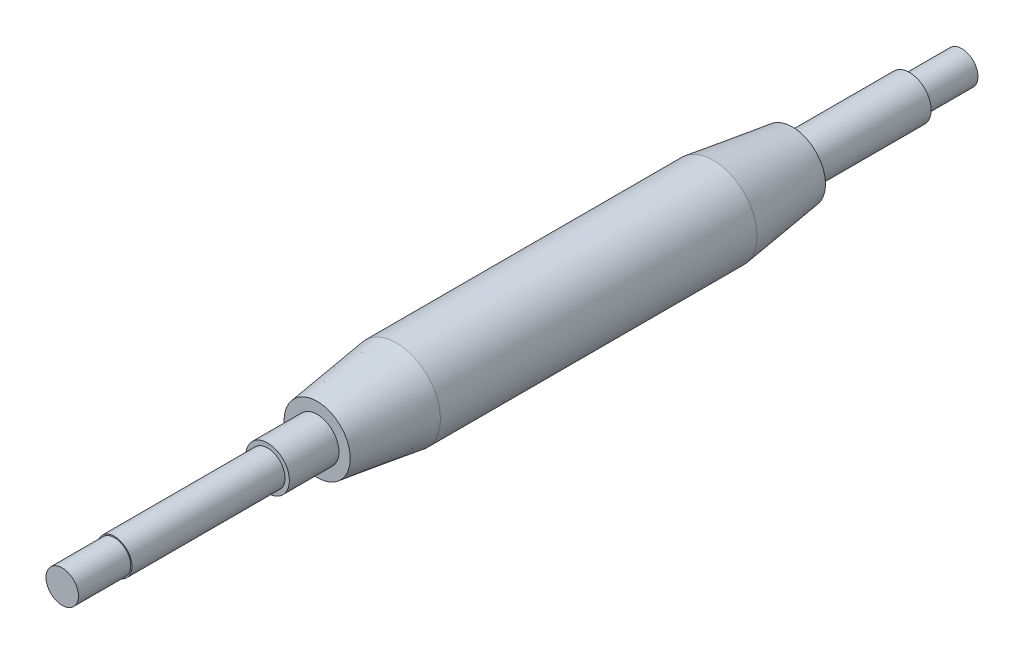
ISO-10303-21;
HEADER;
FILE_DESCRIPTION(('STEP AP214'),'2;1');
FILE_NAME('part.step','',(''),(''),'','','');
FILE_SCHEMA(('AUTOMOTIVE_DESIGN { 1 0 10303 214 1 1 1 1 }'));
ENDSEC;
DATA;
#1=APPLICATION_CONTEXT('core data for automotive mechanical design processes');
#2=APPLICATION_PROTOCOL_DEFINITION('international standard','automotive_design',2000,#1);
#3=PRODUCT_CONTEXT('',#1,'mechanical');
#4=PRODUCT('Part','Part','',(#3));
#5=PRODUCT_RELATED_PRODUCT_CATEGORY('part','',(#4));
#6=PRODUCT_DEFINITION_FORMATION('','',#4);
#7=PRODUCT_DEFINITION_CONTEXT('part definition',#1,'design');
#8=PRODUCT_DEFINITION('design','',#6,#7);
#9=PRODUCT_DEFINITION_SHAPE('','',#8);
#10=(LENGTH_UNIT() NAMED_UNIT(*) SI_UNIT(.MILLI.,.METRE.));
#11=(NAMED_UNIT(*) PLANE_ANGLE_UNIT() SI_UNIT($,.RADIAN.));
#12=(NAMED_UNIT(*) SI_UNIT($,.STERADIAN.) SOLID_ANGLE_UNIT());
#13=UNCERTAINTY_MEASURE_WITH_UNIT(LENGTH_MEASURE(1.E-05),#10,'distance_accuracy_value','');
#14=(GEOMETRIC_REPRESENTATION_CONTEXT(3) GLOBAL_UNCERTAINTY_ASSIGNED_CONTEXT((#13)) GLOBAL_UNIT_ASSIGNED_CONTEXT((#10,
#11,#12)) REPRESENTATION_CONTEXT('',''));
#15=CARTESIAN_POINT('',(0.,0.,0.));
#16=DIRECTION('',(0.,0.,1.));
#17=DIRECTION('',(1.,0.,0.));
#18=AXIS2_PLACEMENT_3D('',#15,#16,#17);
#19=CARTESIAN_POINT('',(0.,0.,59.9413881748072));
#20=DIRECTION('',(0.,0.,1.));
#21=DIRECTION('',(1.,0.,0.));
#22=AXIS2_PLACEMENT_3D('',#19,#20,#21);
#23=CYLINDRICAL_SURFACE('',#22,3.95);
#24=CARTESIAN_POINT('',(0.,0.,-27.8));
#25=DIRECTION('',(0.,0.,1.));
#26=DIRECTION('',(1.,0.,0.));
#27=AXIS2_PLACEMENT_3D('',#24,#25,#26);
#28=CIRCLE('',#27,3.95);
#29=CARTESIAN_POINT('',(3.95,0.,-27.8));
#30=VERTEX_POINT('',#29);
#31=EDGE_CURVE('E10',#30,#30,#28,.T.);
#32=ORIENTED_EDGE('',*,*,#31,.F.);
#33=EDGE_LOOP('',(#32));
#34=FACE_BOUND('',#33,.T.);
#35=CARTESIAN_POINT('',(0.,0.,-36.8));
#36=DIRECTION('',(0.,0.,1.));
#37=DIRECTION('',(1.,0.,0.));
#38=AXIS2_PLACEMENT_3D('',#35,#36,#37);
#39=CIRCLE('',#38,3.95);
#40=CARTESIAN_POINT('',(3.95,0.,-36.8));
#41=VERTEX_POINT('',#40);
#42=EDGE_CURVE('E100',#41,#41,#39,.T.);
#43=ORIENTED_EDGE('',*,*,#42,.T.);
#44=EDGE_LOOP('',(#43));
#45=FACE_BOUND('',#44,.T.);
#46=ADVANCED_FACE('F41',(#34,#45),#23,.T.);
#47=CARTESIAN_POINT('',(0.,3.16,-27.8));
#48=DIRECTION('',(0.,0.,-1.));
#49=DIRECTION('',(-1.,0.,0.));
#50=AXIS2_PLACEMENT_3D('',#47,#48,#49);
#51=PLANE('',#50);
#52=CARTESIAN_POINT('',(0.,0.,-27.8));
#53=DIRECTION('',(0.,0.,1.));
#54=DIRECTION('',(1.,0.,0.));
#55=AXIS2_PLACEMENT_3D('',#52,#53,#54);
#56=CIRCLE('',#55,3.16);
#57=CARTESIAN_POINT('',(3.16,0.,-27.8));
#58=VERTEX_POINT('',#57);
#59=EDGE_CURVE('E48',#58,#58,#56,.T.);
#60=ORIENTED_EDGE('',*,*,#59,.F.);
#61=EDGE_LOOP('',(#60));
#62=FACE_BOUND('',#61,.T.);
#63=ORIENTED_EDGE('',*,*,#31,.T.);
#64=EDGE_LOOP('',(#63));
#65=FACE_BOUND('',#64,.T.);
#66=ADVANCED_FACE('F165',(#62,#65),#51,.F.);
#67=CARTESIAN_POINT('',(0.,0.,59.9413881748072));
#68=DIRECTION('',(0.,0.,1.));
#69=DIRECTION('',(1.,0.,0.));
#70=AXIS2_PLACEMENT_3D('',#67,#68,#69);
#71=CYLINDRICAL_SURFACE('',#70,3.16);
#72=CARTESIAN_POINT('',(0.,0.,0.));
#73=DIRECTION('',(0.,0.,1.));
#74=DIRECTION('',(1.,0.,0.));
#75=AXIS2_PLACEMENT_3D('',#72,#73,#74);
#76=CIRCLE('',#75,3.16);
#77=CARTESIAN_POINT('',(3.16,0.,0.));
#78=VERTEX_POINT('',#77);
#79=EDGE_CURVE('E53',#78,#78,#76,.T.);
#80=ORIENTED_EDGE('',*,*,#79,.F.);
#81=EDGE_LOOP('',(#80));
#82=FACE_BOUND('',#81,.T.);
#83=ORIENTED_EDGE('',*,*,#59,.T.);
#84=EDGE_LOOP('',(#83));
#85=FACE_BOUND('',#84,.T.);
#86=ADVANCED_FACE('F170',(#82,#85),#71,.T.);
#87=CARTESIAN_POINT('',(0.,2.95,0.));
#88=DIRECTION('',(0.,0.,-1.));
#89=DIRECTION('',(-1.,0.,0.));
#90=AXIS2_PLACEMENT_3D('',#87,#88,#89);
#91=PLANE('',#90);
#92=CARTESIAN_POINT('',(0.,0.,0.));
#93=DIRECTION('',(0.,0.,1.));
#94=DIRECTION('',(1.,0.,0.));
#95=AXIS2_PLACEMENT_3D('',#92,#93,#94);
#96=CIRCLE('',#95,2.95);
#97=CARTESIAN_POINT('',(2.95,0.,0.));
#98=VERTEX_POINT('',#97);
#99=EDGE_CURVE('E58',#98,#98,#96,.T.);
#100=ORIENTED_EDGE('',*,*,#99,.F.);
#101=EDGE_LOOP('',(#100));
#102=FACE_BOUND('',#101,.T.);
#103=ORIENTED_EDGE('',*,*,#79,.T.);
#104=EDGE_LOOP('',(#103));
#105=FACE_BOUND('',#104,.T.);
#106=ADVANCED_FACE('F175',(#102,#105),#91,.F.);
#107=CARTESIAN_POINT('',(0.,0.,59.9413881748072));
#108=DIRECTION('',(0.,0.,1.));
#109=DIRECTION('',(1.,0.,0.));
#110=AXIS2_PLACEMENT_3D('',#107,#108,#109);
#111=CYLINDRICAL_SURFACE('',#110,2.95);
#112=CARTESIAN_POINT('',(0.,0.,9.5));
#113=DIRECTION('',(0.,0.,1.));
#114=DIRECTION('',(1.,0.,0.));
#115=AXIS2_PLACEMENT_3D('',#112,#113,#114);
#116=CIRCLE('',#115,2.95);
#117=CARTESIAN_POINT('',(2.95,0.,9.5));
#118=VERTEX_POINT('',#117);
#119=EDGE_CURVE('E64',#118,#118,#116,.T.);
#120=ORIENTED_EDGE('',*,*,#119,.F.);
#121=EDGE_LOOP('',(#120));
#122=FACE_BOUND('',#121,.T.);
#123=ORIENTED_EDGE('',*,*,#99,.T.);
#124=EDGE_LOOP('',(#123));
#125=FACE_BOUND('',#124,.T.);
#126=ADVANCED_FACE('F161',(#122,#125),#111,.T.);
#127=CARTESIAN_POINT('',(0.,2.95,9.5));
#128=DIRECTION('',(0.,0.,-1.));
#129=DIRECTION('',(-1.,0.,0.));
#130=AXIS2_PLACEMENT_3D('',#127,#128,#129);
#131=PLANE('',#130);
#132=ORIENTED_EDGE('',*,*,#119,.T.);
#133=EDGE_LOOP('',(#132));
#134=FACE_BOUND('',#133,.T.);
#135=ADVANCED_FACE('F156',(#134),#131,.F.);
#136=CARTESIAN_POINT('',(0.,2.95,-153.85));
#137=DIRECTION('',(0.,0.,1.));
#138=DIRECTION('',(1.,0.,0.));
#139=AXIS2_PLACEMENT_3D('',#136,#137,#138);
#140=PLANE('',#139);
#141=CARTESIAN_POINT('',(0.,0.,-153.85));
#142=DIRECTION('',(0.,0.,1.));
#143=DIRECTION('',(1.,0.,0.));
#144=AXIS2_PLACEMENT_3D('',#141,#142,#143);
#145=CIRCLE('',#144,2.95);
#146=CARTESIAN_POINT('',(2.95,0.,-153.85));
#147=VERTEX_POINT('',#146);
#148=EDGE_CURVE('E68',#147,#147,#145,.T.);
#149=ORIENTED_EDGE('',*,*,#148,.F.);
#150=EDGE_LOOP('',(#149));
#151=FACE_BOUND('',#150,.T.);
#152=ADVANCED_FACE('F151',(#151),#140,.F.);
#153=CARTESIAN_POINT('',(0.,0.,59.9413881748072));
#154=DIRECTION('',(0.,0.,1.));
#155=DIRECTION('',(1.,0.,0.));
#156=AXIS2_PLACEMENT_3D('',#153,#154,#155);
#157=CYLINDRICAL_SURFACE('',#156,2.95);
#158=CARTESIAN_POINT('',(0.,0.,-144.35));
#159=DIRECTION('',(0.,0.,1.));
#160=DIRECTION('',(1.,0.,0.));
#161=AXIS2_PLACEMENT_3D('',#158,#159,#160);
#162=CIRCLE('',#161,2.95);
#163=CARTESIAN_POINT('',(2.95,0.,-144.35));
#164=VERTEX_POINT('',#163);
#165=EDGE_CURVE('E72',#164,#164,#162,.T.);
#166=ORIENTED_EDGE('',*,*,#165,.F.);
#167=EDGE_LOOP('',(#166));
#168=FACE_BOUND('',#167,.T.);
#169=ORIENTED_EDGE('',*,*,#148,.T.);
#170=EDGE_LOOP('',(#169));
#171=FACE_BOUND('',#170,.T.);
#172=ADVANCED_FACE('F145',(#168,#171),#157,.T.);
#173=CARTESIAN_POINT('',(0.,3.95,-144.35));
#174=DIRECTION('',(0.,0.,1.));
#175=DIRECTION('',(1.,0.,0.));
#176=AXIS2_PLACEMENT_3D('',#173,#174,#175);
#177=PLANE('',#176);
#178=CARTESIAN_POINT('',(0.,0.,-144.35));
#179=DIRECTION('',(0.,0.,1.));
#180=DIRECTION('',(1.,0.,0.));
#181=AXIS2_PLACEMENT_3D('',#178,#179,#180);
#182=CIRCLE('',#181,3.95);
#183=CARTESIAN_POINT('',(3.95,0.,-144.35));
#184=VERTEX_POINT('',#183);
#185=EDGE_CURVE('E76',#184,#184,#182,.T.);
#186=ORIENTED_EDGE('',*,*,#185,.F.);
#187=EDGE_LOOP('',(#186));
#188=FACE_BOUND('',#187,.T.);
#189=ORIENTED_EDGE('',*,*,#165,.T.);
#190=EDGE_LOOP('',(#189));
#191=FACE_BOUND('',#190,.T.);
#192=ADVANCED_FACE('F139',(#188,#191),#177,.F.);
#193=CARTESIAN_POINT('',(0.,0.,59.9413881748072));
#194=DIRECTION('',(0.,0.,1.));
#195=DIRECTION('',(1.,0.,0.));
#196=AXIS2_PLACEMENT_3D('',#193,#194,#195);
#197=CYLINDRICAL_SURFACE('',#196,3.95);
#198=CARTESIAN_POINT('',(0.,0.,-123.1));
#199=DIRECTION('',(0.,0.,1.));
#200=DIRECTION('',(1.,0.,0.));
#201=AXIS2_PLACEMENT_3D('',#198,#199,#200);
#202=CIRCLE('',#201,3.95);
#203=CARTESIAN_POINT('',(3.95,0.,-123.1));
#204=VERTEX_POINT('',#203);
#205=EDGE_CURVE('E80',#204,#204,#202,.T.);
#206=ORIENTED_EDGE('',*,*,#205,.F.);
#207=EDGE_LOOP('',(#206));
#208=FACE_BOUND('',#207,.T.);
#209=ORIENTED_EDGE('',*,*,#185,.T.);
#210=EDGE_LOOP('',(#209));
#211=FACE_BOUND('',#210,.T.);
#212=ADVANCED_FACE('F133',(#208,#211),#197,.T.);
#213=CARTESIAN_POINT('',(0.,6.,-123.1));
#214=DIRECTION('',(0.,0.,1.));
#215=DIRECTION('',(1.,0.,0.));
#216=AXIS2_PLACEMENT_3D('',#213,#214,#215);
#217=PLANE('',#216);
#218=CARTESIAN_POINT('',(0.,0.,-123.1));
#219=DIRECTION('',(0.,0.,1.));
#220=DIRECTION('',(1.,0.,0.));
#221=AXIS2_PLACEMENT_3D('',#218,#219,#220);
#222=CIRCLE('',#221,6.);
#223=CARTESIAN_POINT('',(6.,0.,-123.1));
#224=VERTEX_POINT('',#223);
#225=EDGE_CURVE('E84',#224,#224,#222,.T.);
#226=ORIENTED_EDGE('',*,*,#225,.F.);
#227=EDGE_LOOP('',(#226));
#228=FACE_BOUND('',#227,.T.);
#229=ORIENTED_EDGE('',*,*,#205,.T.);
#230=EDGE_LOOP('',(#229));
#231=FACE_BOUND('',#230,.T.);
#232=ADVANCED_FACE('F127',(#228,#231),#217,.F.);
#233=CARTESIAN_POINT('',(0.,0.,-123.1));
#234=DIRECTION('',(0.,0.,1.));
#235=DIRECTION('',(1.,0.,0.));
#236=AXIS2_PLACEMENT_3D('',#233,#234,#235);
#237=CONICAL_SURFACE('',#236,6.,0.136302367173176);
#238=CARTESIAN_POINT('',(0.,0.,-108.7));
#239=DIRECTION('',(0.,0.,1.));
#240=DIRECTION('',(1.,0.,0.));
#241=AXIS2_PLACEMENT_3D('',#238,#239,#240);
#242=CIRCLE('',#241,7.975);
#243=CARTESIAN_POINT('',(7.975,0.,-108.7));
#244=VERTEX_POINT('',#243);
#245=EDGE_CURVE('E88',#244,#244,#242,.T.);
#246=ORIENTED_EDGE('',*,*,#245,.F.);
#247=EDGE_LOOP('',(#246));
#248=FACE_BOUND('',#247,.T.);
#249=ORIENTED_EDGE('',*,*,#225,.T.);
#250=EDGE_LOOP('',(#249));
#251=FACE_BOUND('',#250,.T.);
#252=ADVANCED_FACE('F121',(#248,#251),#237,.T.);
#253=CARTESIAN_POINT('',(0.,0.,59.9413881748072));
#254=DIRECTION('',(0.,0.,1.));
#255=DIRECTION('',(1.,0.,0.));
#256=AXIS2_PLACEMENT_3D('',#253,#254,#255);
#257=CYLINDRICAL_SURFACE('',#256,7.975);
#258=CARTESIAN_POINT('',(0.,0.,-51.2));
#259=DIRECTION('',(0.,0.,1.));
#260=DIRECTION('',(1.,0.,0.));
#261=AXIS2_PLACEMENT_3D('',#258,#259,#260);
#262=CIRCLE('',#261,7.975);
#263=CARTESIAN_POINT('',(7.975,0.,-51.2));
#264=VERTEX_POINT('',#263);
#265=EDGE_CURVE('E92',#264,#264,#262,.T.);
#266=ORIENTED_EDGE('',*,*,#265,.F.);
#267=EDGE_LOOP('',(#266));
#268=FACE_BOUND('',#267,.T.);
#269=ORIENTED_EDGE('',*,*,#245,.T.);
#270=EDGE_LOOP('',(#269));
#271=FACE_BOUND('',#270,.T.);
#272=ADVANCED_FACE('F115',(#268,#271),#257,.T.);
#273=CARTESIAN_POINT('',(0.,0.,-51.2));
#274=DIRECTION('',(0.,0.,-1.));
#275=DIRECTION('',(-1.,0.,0.));
#276=AXIS2_PLACEMENT_3D('',#273,#274,#275);
#277=CONICAL_SURFACE('',#276,7.975,0.136302367173177);
#278=CARTESIAN_POINT('',(0.,0.,-36.8));
#279=DIRECTION('',(0.,0.,1.));
#280=DIRECTION('',(1.,0.,0.));
#281=AXIS2_PLACEMENT_3D('',#278,#279,#280);
#282=CIRCLE('',#281,6.);
#283=CARTESIAN_POINT('',(6.,0.,-36.8));
#284=VERTEX_POINT('',#283);
#285=EDGE_CURVE('E96',#284,#284,#282,.T.);
#286=ORIENTED_EDGE('',*,*,#285,.F.);
#287=EDGE_LOOP('',(#286));
#288=FACE_BOUND('',#287,.T.);
#289=ORIENTED_EDGE('',*,*,#265,.T.);
#290=EDGE_LOOP('',(#289));
#291=FACE_BOUND('',#290,.T.);
#292=ADVANCED_FACE('F109',(#288,#291),#277,.T.);
#293=CARTESIAN_POINT('',(0.,3.95,-36.8));
#294=DIRECTION('',(0.,0.,-1.));
#295=DIRECTION('',(-1.,0.,0.));
#296=AXIS2_PLACEMENT_3D('',#293,#294,#295);
#297=PLANE('',#296);
#298=ORIENTED_EDGE('',*,*,#42,.F.);
#299=EDGE_LOOP('',(#298));
#300=FACE_BOUND('',#299,.T.);
#301=ORIENTED_EDGE('',*,*,#285,.T.);
#302=EDGE_LOOP('',(#301));
#303=FACE_BOUND('',#302,.T.);
#304=ADVANCED_FACE('F106',(#300,#303),#297,.F.);
#305=CLOSED_SHELL('',(#46,#66,#86,#106,#126,#135,#152,#172,#192,#212,#232,#252,#272,#292,#304));
#306=MANIFOLD_SOLID_BREP('B2',#305);
#307=ADVANCED_BREP_SHAPE_REPRESENTATION('',(#18,#306),#14);
#308=SHAPE_DEFINITION_REPRESENTATION(#9,#307);
ENDSEC;
END-ISO-10303-21;
